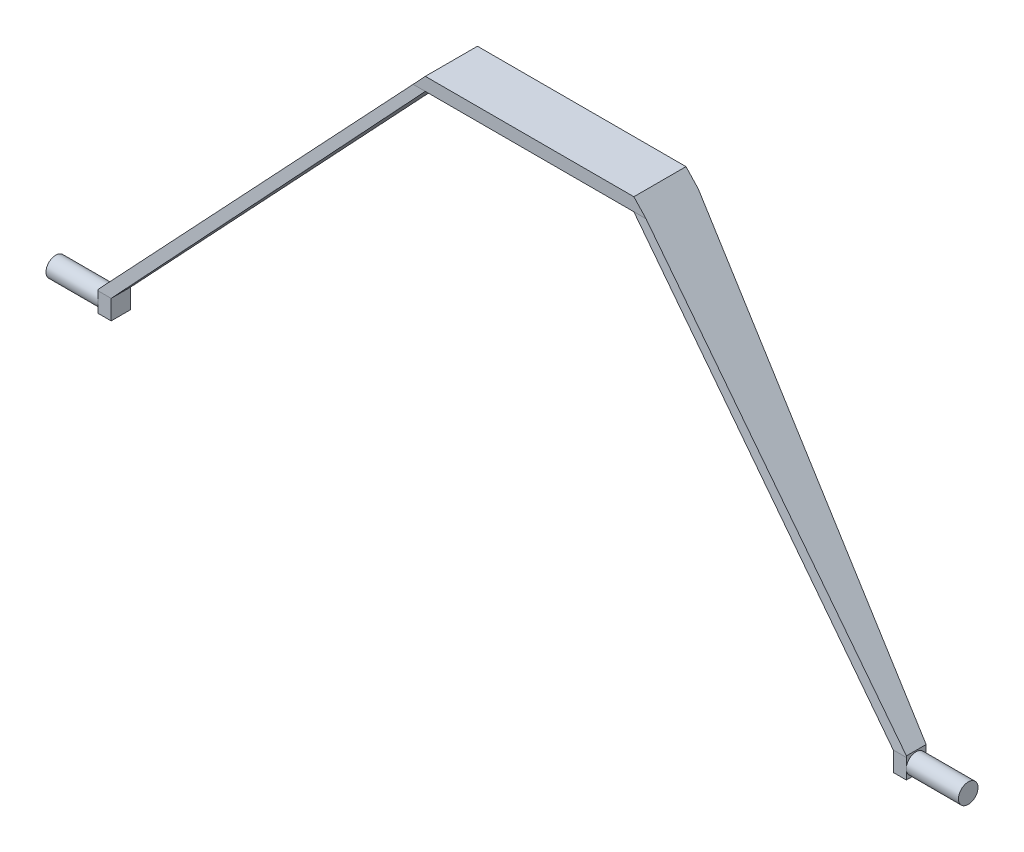
ISO-10303-21;
HEADER;
FILE_DESCRIPTION(('STEP AP214'),'2;1');
FILE_NAME('part.step','',(''),(''),'','','');
FILE_SCHEMA(('AUTOMOTIVE_DESIGN { 1 0 10303 214 1 1 1 1 }'));
ENDSEC;
DATA;
#1=APPLICATION_CONTEXT('core data for automotive mechanical design processes');
#2=APPLICATION_PROTOCOL_DEFINITION('international standard','automotive_design',2000,#1);
#3=PRODUCT_CONTEXT('',#1,'mechanical');
#4=PRODUCT('Part','Part','',(#3));
#5=PRODUCT_RELATED_PRODUCT_CATEGORY('part','',(#4));
#6=PRODUCT_DEFINITION_FORMATION('','',#4);
#7=PRODUCT_DEFINITION_CONTEXT('part definition',#1,'design');
#8=PRODUCT_DEFINITION('design','',#6,#7);
#9=PRODUCT_DEFINITION_SHAPE('','',#8);
#10=(LENGTH_UNIT() NAMED_UNIT(*) SI_UNIT(.MILLI.,.METRE.));
#11=(NAMED_UNIT(*) PLANE_ANGLE_UNIT() SI_UNIT($,.RADIAN.));
#12=(NAMED_UNIT(*) SI_UNIT($,.STERADIAN.) SOLID_ANGLE_UNIT());
#13=UNCERTAINTY_MEASURE_WITH_UNIT(LENGTH_MEASURE(1.E-05),#10,'distance_accuracy_value','');
#14=(GEOMETRIC_REPRESENTATION_CONTEXT(3) GLOBAL_UNCERTAINTY_ASSIGNED_CONTEXT((#13)) GLOBAL_UNIT_ASSIGNED_CONTEXT((#10,
#11,#12)) REPRESENTATION_CONTEXT('',''));
#15=CARTESIAN_POINT('',(0.,0.,0.));
#16=DIRECTION('',(0.,0.,1.));
#17=DIRECTION('',(1.,0.,0.));
#18=AXIS2_PLACEMENT_3D('',#15,#16,#17);
#19=CARTESIAN_POINT('',(787.471663752112,-383.669201703355,-101.6));
#20=DIRECTION('',(1.,0.,0.));
#21=DIRECTION('',(0.,0.,-1.));
#22=AXIS2_PLACEMENT_3D('',#19,#20,#21);
#23=PLANE('',#22);
#24=DIRECTION('',(0.,-0.981687652475557,0.190497645594452));
#25=VECTOR('',#24,1.);
#26=CARTESIAN_POINT('',(787.471663752112,-361.911223308586,10.5249486644394));
#27=LINE('',#26,#25);
#28=CARTESIAN_POINT('',(787.471663752112,-383.669201703355,14.7471100073535));
#29=VERTEX_POINT('',#28);
#30=CARTESIAN_POINT('',(787.471663752112,-386.209201703355,15.24));
#31=VERTEX_POINT('',#30);
#32=EDGE_CURVE('E274',#29,#31,#27,.T.);
#33=ORIENTED_EDGE('',*,*,#32,.F.);
#34=DIRECTION('',(0.,0.,1.));
#35=VECTOR('',#34,1.);
#36=CARTESIAN_POINT('',(787.471663752112,-383.669201703355,-101.6));
#37=LINE('',#36,#35);
#38=CARTESIAN_POINT('',(787.471663752112,-383.669201703355,53.114985003357));
#39=VERTEX_POINT('',#38);
#40=EDGE_CURVE('E189',#29,#39,#37,.T.);
#41=ORIENTED_EDGE('',*,*,#40,.T.);
#42=DIRECTION('',(0.,0.996098977899839,-0.0882429953418222));
#43=VECTOR('',#42,1.);
#44=CARTESIAN_POINT('',(787.471663752112,-370.069946760064,51.9102463004389));
#45=LINE('',#44,#43);
#46=CARTESIAN_POINT('',(787.471663752112,-386.209201703355,53.34));
#47=VERTEX_POINT('',#46);
#48=EDGE_CURVE('E295',#47,#39,#45,.T.);
#49=ORIENTED_EDGE('',*,*,#48,.F.);
#50=DIRECTION('',(0.,1.,0.));
#51=VECTOR('',#50,1.);
#52=CARTESIAN_POINT('',(787.471663752112,-383.669201703355,53.34));
#53=LINE('',#52,#51);
#54=CARTESIAN_POINT('',(787.471663752112,-405.259201703355,53.34));
#55=VERTEX_POINT('',#54);
#56=EDGE_CURVE('E393',#55,#47,#53,.T.);
#57=ORIENTED_EDGE('',*,*,#56,.F.);
#58=CARTESIAN_POINT('',(787.471663752112,-405.259201703355,34.29));
#59=DIRECTION('',(1.,0.,0.));
#60=DIRECTION('',(0.,0.,-1.));
#61=AXIS2_PLACEMENT_3D('',#58,#59,#60);
#62=CIRCLE('',#61,19.05);
#63=CARTESIAN_POINT('',(787.471663752112,-405.259201703355,15.24));
#64=VERTEX_POINT('',#63);
#65=EDGE_CURVE('E214',#64,#55,#62,.T.);
#66=ORIENTED_EDGE('',*,*,#65,.F.);
#67=DIRECTION('',(0.,-1.,0.));
#68=VECTOR('',#67,1.);
#69=CARTESIAN_POINT('',(787.471663752112,-383.669201703355,15.24));
#70=LINE('',#69,#68);
#71=EDGE_CURVE('E307',#31,#64,#70,.T.);
#72=ORIENTED_EDGE('',*,*,#71,.F.);
#73=EDGE_LOOP('',(#33,#41,#49,#57,#66,#72));
#74=FACE_BOUND('',#73,.T.);
#75=ADVANCED_FACE('F39',(#74),#23,.T.);
#76=CARTESIAN_POINT('',(-787.471663752112,-383.669201703355,-101.6));
#77=DIRECTION('',(-1.,0.,0.));
#78=DIRECTION('',(0.,0.,1.));
#79=AXIS2_PLACEMENT_3D('',#76,#77,#78);
#80=PLANE('',#79);
#81=DIRECTION('',(0.,0.981687652475557,-0.190497645594452));
#82=VECTOR('',#81,1.);
#83=CARTESIAN_POINT('',(-787.471663752112,-361.911223308586,10.5249486644394));
#84=LINE('',#83,#82);
#85=CARTESIAN_POINT('',(-787.471663752112,-386.209201703355,15.24));
#86=VERTEX_POINT('',#85);
#87=CARTESIAN_POINT('',(-787.471663752112,-383.669201703355,14.7471100073535));
#88=VERTEX_POINT('',#87);
#89=EDGE_CURVE('E292',#86,#88,#84,.T.);
#90=ORIENTED_EDGE('',*,*,#89,.F.);
#91=DIRECTION('',(0.,1.,0.));
#92=VECTOR('',#91,1.);
#93=CARTESIAN_POINT('',(-787.471663752112,-383.669201703355,15.24));
#94=LINE('',#93,#92);
#95=CARTESIAN_POINT('',(-787.471663752112,-405.259201703355,15.24));
#96=VERTEX_POINT('',#95);
#97=EDGE_CURVE('E318',#96,#86,#94,.T.);
#98=ORIENTED_EDGE('',*,*,#97,.F.);
#99=CARTESIAN_POINT('',(-787.471663752112,-405.259201703355,34.29));
#100=DIRECTION('',(1.,0.,0.));
#101=DIRECTION('',(0.,0.,-1.));
#102=AXIS2_PLACEMENT_3D('',#99,#100,#101);
#103=CIRCLE('',#102,19.05);
#104=CARTESIAN_POINT('',(-787.471663752112,-405.259201703355,53.34));
#105=VERTEX_POINT('',#104);
#106=EDGE_CURVE('E261',#96,#105,#103,.T.);
#107=ORIENTED_EDGE('',*,*,#106,.T.);
#108=DIRECTION('',(0.,-1.,0.));
#109=VECTOR('',#108,1.);
#110=CARTESIAN_POINT('',(-787.471663752112,-383.669201703355,53.34));
#111=LINE('',#110,#109);
#112=CARTESIAN_POINT('',(-787.471663752112,-386.209201703355,53.34));
#113=VERTEX_POINT('',#112);
#114=EDGE_CURVE('E63',#113,#105,#111,.T.);
#115=ORIENTED_EDGE('',*,*,#114,.F.);
#116=DIRECTION('',(0.,-0.996098977899839,0.0882429953418222));
#117=VECTOR('',#116,1.);
#118=CARTESIAN_POINT('',(-787.471663752112,-370.069946760064,51.9102463004389));
#119=LINE('',#118,#117);
#120=CARTESIAN_POINT('',(-787.471663752112,-383.669201703355,53.114985003357));
#121=VERTEX_POINT('',#120);
#122=EDGE_CURVE('E304',#121,#113,#119,.T.);
#123=ORIENTED_EDGE('',*,*,#122,.F.);
#124=DIRECTION('',(0.,0.,1.));
#125=VECTOR('',#124,1.);
#126=CARTESIAN_POINT('',(-787.471663752112,-383.669201703355,-101.6));
#127=LINE('',#126,#125);
#128=EDGE_CURVE('E203',#88,#121,#127,.T.);
#129=ORIENTED_EDGE('',*,*,#128,.F.);
#130=EDGE_LOOP('',(#90,#98,#107,#115,#123,#129));
#131=FACE_BOUND('',#130,.T.);
#132=ADVANCED_FACE('F364',(#131),#80,.T.);
#133=CARTESIAN_POINT('',(0.,0.,53.34));
#134=DIRECTION('',(0.,0.,1.));
#135=DIRECTION('',(1.,0.,0.));
#136=AXIS2_PLACEMENT_3D('',#133,#134,#135);
#137=PLANE('',#136);
#138=DIRECTION('',(1.,0.,0.));
#139=VECTOR('',#138,1.);
#140=CARTESIAN_POINT('',(0.,-386.209201703355,53.34));
#141=LINE('',#140,#139);
#142=CARTESIAN_POINT('',(-762.071663752111,-386.209201703355,53.34));
#143=VERTEX_POINT('',#142);
#144=EDGE_CURVE('E48',#113,#143,#141,.T.);
#145=ORIENTED_EDGE('',*,*,#144,.F.);
#146=ORIENTED_EDGE('',*,*,#114,.T.);
#147=CARTESIAN_POINT('',(-787.471663752112,-424.309201703355,53.34));
#148=VERTEX_POINT('',#147);
#149=EDGE_CURVE('E420',#105,#148,#111,.T.);
#150=ORIENTED_EDGE('',*,*,#149,.T.);
#151=DIRECTION('',(1.,0.,0.));
#152=VECTOR('',#151,1.);
#153=CARTESIAN_POINT('',(-787.471663752112,-424.309201703355,53.34));
#154=LINE('',#153,#152);
#155=CARTESIAN_POINT('',(-762.071663752112,-424.309201703355,53.34));
#156=VERTEX_POINT('',#155);
#157=EDGE_CURVE('E376',#148,#156,#154,.T.);
#158=ORIENTED_EDGE('',*,*,#157,.T.);
#159=DIRECTION('',(0.,1.,0.));
#160=VECTOR('',#159,1.);
#161=CARTESIAN_POINT('',(-762.071663752112,-424.309201703355,53.34));
#162=LINE('',#161,#160);
#163=EDGE_CURVE('E374',#156,#143,#162,.T.);
#164=ORIENTED_EDGE('',*,*,#163,.T.);
#165=EDGE_LOOP('',(#145,#146,#150,#158,#164));
#166=FACE_BOUND('',#165,.T.);
#167=ADVANCED_FACE('F371',(#166),#137,.T.);
#168=ORIENTED_EDGE('',*,*,#149,.F.);
#169=CARTESIAN_POINT('',(-787.471663752112,-424.309201703355,34.29));
#170=VERTEX_POINT('',#169);
#171=EDGE_CURVE('E263',#105,#170,#103,.T.);
#172=ORIENTED_EDGE('',*,*,#171,.T.);
#173=DIRECTION('',(0.,0.,1.));
#174=VECTOR('',#173,1.);
#175=CARTESIAN_POINT('',(-787.471663752112,-424.309201703355,-101.6));
#176=LINE('',#175,#174);
#177=EDGE_CURVE('E249',#170,#148,#176,.T.);
#178=ORIENTED_EDGE('',*,*,#177,.T.);
#179=EDGE_LOOP('',(#168,#172,#178));
#180=FACE_BOUND('',#179,.T.);
#181=ADVANCED_FACE('F472',(#180),#80,.T.);
#182=CARTESIAN_POINT('',(787.471663752112,-424.309201703355,34.29));
#183=VERTEX_POINT('',#182);
#184=EDGE_CURVE('E283',#55,#183,#62,.T.);
#185=ORIENTED_EDGE('',*,*,#184,.F.);
#186=CARTESIAN_POINT('',(787.471663752112,-424.309201703355,53.34));
#187=VERTEX_POINT('',#186);
#188=EDGE_CURVE('E394',#187,#55,#53,.T.);
#189=ORIENTED_EDGE('',*,*,#188,.F.);
#190=DIRECTION('',(0.,0.,1.));
#191=VECTOR('',#190,1.);
#192=CARTESIAN_POINT('',(787.471663752112,-424.309201703355,-101.6));
#193=LINE('',#192,#191);
#194=EDGE_CURVE('E223',#183,#187,#193,.T.);
#195=ORIENTED_EDGE('',*,*,#194,.F.);
#196=EDGE_LOOP('',(#185,#189,#195));
#197=FACE_BOUND('',#196,.T.);
#198=ADVANCED_FACE('F413',(#197),#23,.T.);
#199=CARTESIAN_POINT('',(-203.2,241.3,-101.6));
#200=DIRECTION('',(-0.730491181160132,0.682922128977583,0.));
#201=DIRECTION('',(-0.682922128977583,-0.730491181160132,0.));
#202=AXIS2_PLACEMENT_3D('',#199,#200,#201);
#203=PLANE('',#202);
#204=DIRECTION('',(-0.676162571687912,-0.723260785805915,0.140349607636784));
#205=VECTOR('',#204,1.);
#206=CARTESIAN_POINT('',(-716.188478747163,-307.420774830618,-0.048987063755182));
#207=LINE('',#206,#205);
#208=CARTESIAN_POINT('',(-226.945970551598,215.9,-101.6));
#209=VERTEX_POINT('',#208);
#210=EDGE_CURVE('E55',#209,#88,#207,.T.);
#211=ORIENTED_EDGE('',*,*,#210,.T.);
#212=ORIENTED_EDGE('',*,*,#128,.T.);
#213=DIRECTION('',(0.681496635621806,0.728966394832361,-0.0645780987740409));
#214=VECTOR('',#213,1.);
#215=CARTESIAN_POINT('',(-723.937929376007,-315.71001470586,47.094577037175));
#216=LINE('',#215,#214);
#217=CARTESIAN_POINT('',(-226.945970551598,215.9,0.));
#218=VERTEX_POINT('',#217);
#219=EDGE_CURVE('E332',#121,#218,#216,.T.);
#220=ORIENTED_EDGE('',*,*,#219,.T.);
#221=DIRECTION('',(0.682922128977583,0.730491181160132,0.));
#222=VECTOR('',#221,1.);
#223=CARTESIAN_POINT('',(-713.347967728877,-304.382407554465,0.));
#224=LINE('',#223,#222);
#225=CARTESIAN_POINT('',(-203.2,241.3,0.));
#226=VERTEX_POINT('',#225);
#227=EDGE_CURVE('E326',#218,#226,#224,.T.);
#228=ORIENTED_EDGE('',*,*,#227,.T.);
#229=DIRECTION('',(0.,0.,1.));
#230=VECTOR('',#229,1.);
#231=CARTESIAN_POINT('',(-203.2,241.3,-101.6));
#232=LINE('',#231,#230);
#233=CARTESIAN_POINT('',(-203.2,241.3,-101.6));
#234=VERTEX_POINT('',#233);
#235=EDGE_CURVE('E210',#234,#226,#232,.T.);
#236=ORIENTED_EDGE('',*,*,#235,.F.);
#237=DIRECTION('',(-0.682922128977583,-0.730491181160132,0.));
#238=VECTOR('',#237,1.);
#239=CARTESIAN_POINT('',(-203.2,241.3,-101.6));
#240=LINE('',#239,#238);
#241=EDGE_CURVE('E206',#234,#209,#240,.T.);
#242=ORIENTED_EDGE('',*,*,#241,.T.);
#243=EDGE_LOOP('',(#211,#212,#220,#228,#236,#242));
#244=FACE_BOUND('',#243,.T.);
#245=ADVANCED_FACE('F41',(#244),#203,.T.);
#246=CARTESIAN_POINT('',(-203.2,241.3,-101.6));
#247=DIRECTION('',(0.,1.,0.));
#248=DIRECTION('',(-1.,0.,0.));
#249=AXIS2_PLACEMENT_3D('',#246,#247,#248);
#250=PLANE('',#249);
#251=DIRECTION('',(1.,0.,0.));
#252=VECTOR('',#251,1.);
#253=CARTESIAN_POINT('',(-1297.03997230565,241.3,0.));
#254=LINE('',#253,#252);
#255=CARTESIAN_POINT('',(203.2,241.3,0.));
#256=VERTEX_POINT('',#255);
#257=EDGE_CURVE('E321',#226,#256,#254,.T.);
#258=ORIENTED_EDGE('',*,*,#257,.T.);
#259=DIRECTION('',(0.,0.,1.));
#260=VECTOR('',#259,1.);
#261=CARTESIAN_POINT('',(203.2,241.3,-101.6));
#262=LINE('',#261,#260);
#263=CARTESIAN_POINT('',(203.2,241.3,-101.6));
#264=VERTEX_POINT('',#263);
#265=EDGE_CURVE('E215',#264,#256,#262,.T.);
#266=ORIENTED_EDGE('',*,*,#265,.F.);
#267=DIRECTION('',(-1.,0.,0.));
#268=VECTOR('',#267,1.);
#269=CARTESIAN_POINT('',(-203.2,241.3,-101.6));
#270=LINE('',#269,#268);
#271=EDGE_CURVE('E197',#264,#234,#270,.T.);
#272=ORIENTED_EDGE('',*,*,#271,.T.);
#273=ORIENTED_EDGE('',*,*,#235,.T.);
#274=EDGE_LOOP('',(#258,#266,#272,#273));
#275=FACE_BOUND('',#274,.T.);
#276=ADVANCED_FACE('F498',(#275),#250,.T.);
#277=CARTESIAN_POINT('',(203.2,241.3,-101.6));
#278=DIRECTION('',(0.730491181160132,0.682922128977584,0.));
#279=DIRECTION('',(-0.682922128977584,0.730491181160132,0.));
#280=AXIS2_PLACEMENT_3D('',#277,#278,#279);
#281=PLANE('',#280);
#282=DIRECTION('',(0.676162571687912,-0.723260785805915,0.140349607636784));
#283=VECTOR('',#282,1.);
#284=CARTESIAN_POINT('',(716.188478747164,-307.420774830618,-0.0489870637551265));
#285=LINE('',#284,#283);
#286=CARTESIAN_POINT('',(226.945970551598,215.9,-101.6));
#287=VERTEX_POINT('',#286);
#288=EDGE_CURVE('E172',#287,#29,#285,.T.);
#289=ORIENTED_EDGE('',*,*,#288,.F.);
#290=DIRECTION('',(-0.682922128977583,0.730491181160132,0.));
#291=VECTOR('',#290,1.);
#292=CARTESIAN_POINT('',(203.2,241.3,-101.6));
#293=LINE('',#292,#291);
#294=EDGE_CURVE('E185',#287,#264,#293,.T.);
#295=ORIENTED_EDGE('',*,*,#294,.T.);
#296=ORIENTED_EDGE('',*,*,#265,.T.);
#297=DIRECTION('',(-0.682922128977584,0.730491181160132,0.));
#298=VECTOR('',#297,1.);
#299=CARTESIAN_POINT('',(713.347967728877,-304.382407554465,0.));
#300=LINE('',#299,#298);
#301=CARTESIAN_POINT('',(226.945970551598,215.9,0.));
#302=VERTEX_POINT('',#301);
#303=EDGE_CURVE('E340',#302,#256,#300,.T.);
#304=ORIENTED_EDGE('',*,*,#303,.F.);
#305=DIRECTION('',(-0.681496635621806,0.728966394832361,-0.0645780987740408));
#306=VECTOR('',#305,1.);
#307=CARTESIAN_POINT('',(723.937929376008,-315.71001470586,47.094577037175));
#308=LINE('',#307,#306);
#309=EDGE_CURVE('E336',#39,#302,#308,.T.);
#310=ORIENTED_EDGE('',*,*,#309,.F.);
#311=ORIENTED_EDGE('',*,*,#40,.F.);
#312=EDGE_LOOP('',(#289,#295,#296,#304,#310,#311));
#313=FACE_BOUND('',#312,.T.);
#314=ADVANCED_FACE('F183',(#313),#281,.T.);
#315=CARTESIAN_POINT('',(787.471663752112,-424.309201703355,15.24));
#316=VERTEX_POINT('',#315);
#317=EDGE_CURVE('E315',#64,#316,#70,.T.);
#318=ORIENTED_EDGE('',*,*,#317,.F.);
#319=EDGE_CURVE('E268',#183,#64,#62,.T.);
#320=ORIENTED_EDGE('',*,*,#319,.F.);
#321=EDGE_CURVE('E220',#316,#183,#193,.T.);
#322=ORIENTED_EDGE('',*,*,#321,.F.);
#323=EDGE_LOOP('',(#318,#320,#322));
#324=FACE_BOUND('',#323,.T.);
#325=ADVANCED_FACE('F429',(#324),#23,.T.);
#326=CARTESIAN_POINT('',(787.471663752112,-424.309201703355,-101.6));
#327=DIRECTION('',(0.,-1.,0.));
#328=DIRECTION('',(0.,0.,-1.));
#329=AXIS2_PLACEMENT_3D('',#326,#327,#328);
#330=PLANE('',#329);
#331=DIRECTION('',(1.,0.,0.));
#332=VECTOR('',#331,1.);
#333=CARTESIAN_POINT('',(-1297.03997230565,-424.309201703355,15.24));
#334=LINE('',#333,#332);
#335=CARTESIAN_POINT('',(762.071663752112,-424.309201703355,15.24));
#336=VERTEX_POINT('',#335);
#337=EDGE_CURVE('E347',#336,#316,#334,.T.);
#338=ORIENTED_EDGE('',*,*,#337,.T.);
#339=ORIENTED_EDGE('',*,*,#321,.T.);
#340=ORIENTED_EDGE('',*,*,#194,.T.);
#341=DIRECTION('',(1.,0.,0.));
#342=VECTOR('',#341,1.);
#343=CARTESIAN_POINT('',(787.471663752112,-424.309201703355,53.34));
#344=LINE('',#343,#342);
#345=CARTESIAN_POINT('',(762.071663752112,-424.309201703355,53.34));
#346=VERTEX_POINT('',#345);
#347=EDGE_CURVE('E385',#346,#187,#344,.T.);
#348=ORIENTED_EDGE('',*,*,#347,.F.);
#349=DIRECTION('',(0.,0.,1.));
#350=VECTOR('',#349,1.);
#351=CARTESIAN_POINT('',(762.071663752112,-424.309201703355,-101.6));
#352=LINE('',#351,#350);
#353=EDGE_CURVE('E224',#336,#346,#352,.T.);
#354=ORIENTED_EDGE('',*,*,#353,.F.);
#355=EDGE_LOOP('',(#338,#339,#340,#348,#354));
#356=FACE_BOUND('',#355,.T.);
#357=ADVANCED_FACE('F435',(#356),#330,.T.);
#358=CARTESIAN_POINT('',(762.071663752112,-424.309201703355,-101.6));
#359=DIRECTION('',(-1.,0.,0.));
#360=DIRECTION('',(0.,0.,1.));
#361=AXIS2_PLACEMENT_3D('',#358,#359,#360);
#362=PLANE('',#361);
#363=DIRECTION('',(0.,1.,0.));
#364=VECTOR('',#363,1.);
#365=CARTESIAN_POINT('',(762.071663752112,-424.309201703355,15.24));
#366=LINE('',#365,#364);
#367=CARTESIAN_POINT('',(762.071663752112,-386.209201703355,15.24));
#368=VERTEX_POINT('',#367);
#369=EDGE_CURVE('E308',#336,#368,#366,.T.);
#370=ORIENTED_EDGE('',*,*,#369,.F.);
#371=ORIENTED_EDGE('',*,*,#353,.T.);
#372=DIRECTION('',(0.,-1.,0.));
#373=VECTOR('',#372,1.);
#374=CARTESIAN_POINT('',(762.071663752112,-424.309201703355,53.34));
#375=LINE('',#374,#373);
#376=CARTESIAN_POINT('',(762.071663752112,-386.209201703355,53.34));
#377=VERTEX_POINT('',#376);
#378=EDGE_CURVE('E380',#377,#346,#375,.T.);
#379=ORIENTED_EDGE('',*,*,#378,.F.);
#380=DIRECTION('',(0.,0.,1.));
#381=VECTOR('',#380,1.);
#382=CARTESIAN_POINT('',(762.071663752112,-386.209201703355,-101.6));
#383=LINE('',#382,#381);
#384=EDGE_CURVE('E227',#368,#377,#383,.T.);
#385=ORIENTED_EDGE('',*,*,#384,.F.);
#386=EDGE_LOOP('',(#370,#371,#379,#385));
#387=FACE_BOUND('',#386,.T.);
#388=ADVANCED_FACE('F438',(#387),#362,.T.);
#389=CARTESIAN_POINT('',(762.071663752112,-386.209201703355,-101.6));
#390=DIRECTION('',(-0.732932920293633,-0.680300914559025,0.));
#391=DIRECTION('',(0.680300914559025,-0.732932920293633,0.));
#392=AXIS2_PLACEMENT_3D('',#389,#390,#391);
#393=PLANE('',#392);
#394=DIRECTION('',(-0.673522882906171,0.725630500986452,-0.140809453659583));
#395=VECTOR('',#394,1.);
#396=CARTESIAN_POINT('',(750.990746361577,-374.271000579751,12.9233780062889));
#397=LINE('',#396,#395);
#398=CARTESIAN_POINT('',(203.2,215.9,-101.6));
#399=VERTEX_POINT('',#398);
#400=EDGE_CURVE('E176',#368,#399,#397,.T.);
#401=ORIENTED_EDGE('',*,*,#400,.F.);
#402=ORIENTED_EDGE('',*,*,#384,.T.);
#403=DIRECTION('',(0.678871413535743,-0.731392824819506,0.0647930527643605));
#404=VECTOR('',#403,1.);
#405=CARTESIAN_POINT('',(755.256449466988,-378.866723100837,52.6895402369698));
#406=LINE('',#405,#404);
#407=CARTESIAN_POINT('',(203.2,215.9,0.));
#408=VERTEX_POINT('',#407);
#409=EDGE_CURVE('E298',#408,#377,#406,.T.);
#410=ORIENTED_EDGE('',*,*,#409,.F.);
#411=DIRECTION('',(0.,0.,1.));
#412=VECTOR('',#411,1.);
#413=CARTESIAN_POINT('',(203.2,215.9,-101.6));
#414=LINE('',#413,#412);
#415=EDGE_CURVE('E231',#399,#408,#414,.T.);
#416=ORIENTED_EDGE('',*,*,#415,.F.);
#417=EDGE_LOOP('',(#401,#402,#410,#416));
#418=FACE_BOUND('',#417,.T.);
#419=ADVANCED_FACE('F441',(#418),#393,.T.);
#420=CARTESIAN_POINT('',(-203.2,215.9,-101.6));
#421=DIRECTION('',(0.,-1.,0.));
#422=DIRECTION('',(1.,0.,0.));
#423=AXIS2_PLACEMENT_3D('',#420,#421,#422);
#424=PLANE('',#423);
#425=DIRECTION('',(1.,0.,0.));
#426=VECTOR('',#425,1.);
#427=CARTESIAN_POINT('',(-1297.03997230565,215.9,0.));
#428=LINE('',#427,#426);
#429=CARTESIAN_POINT('',(-203.2,215.9,0.));
#430=VERTEX_POINT('',#429);
#431=EDGE_CURVE('E327',#430,#408,#428,.T.);
#432=ORIENTED_EDGE('',*,*,#431,.F.);
#433=DIRECTION('',(0.,0.,1.));
#434=VECTOR('',#433,1.);
#435=CARTESIAN_POINT('',(-203.2,215.9,-101.6));
#436=LINE('',#435,#434);
#437=CARTESIAN_POINT('',(-203.2,215.9,-101.6));
#438=VERTEX_POINT('',#437);
#439=EDGE_CURVE('E235',#438,#430,#436,.T.);
#440=ORIENTED_EDGE('',*,*,#439,.F.);
#441=DIRECTION('',(1.,0.,0.));
#442=VECTOR('',#441,1.);
#443=CARTESIAN_POINT('',(-203.2,215.9,-101.6));
#444=LINE('',#443,#442);
#445=EDGE_CURVE('E199',#438,#399,#444,.T.);
#446=ORIENTED_EDGE('',*,*,#445,.T.);
#447=ORIENTED_EDGE('',*,*,#415,.T.);
#448=EDGE_LOOP('',(#432,#440,#446,#447));
#449=FACE_BOUND('',#448,.T.);
#450=ADVANCED_FACE('F446',(#449),#424,.T.);
#451=CARTESIAN_POINT('',(-762.071663752112,-386.209201703355,-101.6));
#452=DIRECTION('',(0.732932920293634,-0.680300914559025,0.));
#453=DIRECTION('',(0.680300914559025,0.732932920293634,0.));
#454=AXIS2_PLACEMENT_3D('',#451,#452,#453);
#455=PLANE('',#454);
#456=DIRECTION('',(-0.673522882906171,-0.725630500986452,0.140809453659583));
#457=VECTOR('',#456,1.);
#458=CARTESIAN_POINT('',(-750.990746361577,-374.271000579751,12.9233780062889));
#459=LINE('',#458,#457);
#460=CARTESIAN_POINT('',(-762.071663752112,-386.209201703355,15.24));
#461=VERTEX_POINT('',#460);
#462=EDGE_CURVE('E287',#438,#461,#459,.T.);
#463=ORIENTED_EDGE('',*,*,#462,.F.);
#464=ORIENTED_EDGE('',*,*,#439,.T.);
#465=DIRECTION('',(0.678871413535743,0.731392824819506,-0.0647930527643606));
#466=VECTOR('',#465,1.);
#467=CARTESIAN_POINT('',(-755.256449466988,-378.866723100838,52.6895402369698));
#468=LINE('',#467,#466);
#469=EDGE_CURVE('E301',#143,#430,#468,.T.);
#470=ORIENTED_EDGE('',*,*,#469,.F.);
#471=DIRECTION('',(0.,0.,1.));
#472=VECTOR('',#471,1.);
#473=CARTESIAN_POINT('',(-762.071663752112,-386.209201703355,-101.6));
#474=LINE('',#473,#472);
#475=EDGE_CURVE('E239',#461,#143,#474,.T.);
#476=ORIENTED_EDGE('',*,*,#475,.F.);
#477=EDGE_LOOP('',(#463,#464,#470,#476));
#478=FACE_BOUND('',#477,.T.);
#479=ADVANCED_FACE('F453',(#478),#455,.T.);
#480=CARTESIAN_POINT('',(-762.071663752112,-424.309201703355,-101.6));
#481=DIRECTION('',(1.,0.,0.));
#482=DIRECTION('',(0.,0.,-1.));
#483=AXIS2_PLACEMENT_3D('',#480,#481,#482);
#484=PLANE('',#483);
#485=DIRECTION('',(0.,-1.,0.));
#486=VECTOR('',#485,1.);
#487=CARTESIAN_POINT('',(-762.071663752112,-424.309201703355,15.24));
#488=LINE('',#487,#486);
#489=CARTESIAN_POINT('',(-762.071663752112,-424.309201703355,15.24));
#490=VERTEX_POINT('',#489);
#491=EDGE_CURVE('E311',#461,#490,#488,.T.);
#492=ORIENTED_EDGE('',*,*,#491,.F.);
#493=ORIENTED_EDGE('',*,*,#475,.T.);
#494=ORIENTED_EDGE('',*,*,#163,.F.);
#495=DIRECTION('',(0.,0.,1.));
#496=VECTOR('',#495,1.);
#497=CARTESIAN_POINT('',(-762.071663752112,-424.309201703355,-101.6));
#498=LINE('',#497,#496);
#499=EDGE_CURVE('E243',#490,#156,#498,.T.);
#500=ORIENTED_EDGE('',*,*,#499,.F.);
#501=EDGE_LOOP('',(#492,#493,#494,#500));
#502=FACE_BOUND('',#501,.T.);
#503=ADVANCED_FACE('F455',(#502),#484,.T.);
#504=CARTESIAN_POINT('',(-787.471663752112,-424.309201703355,-101.6));
#505=DIRECTION('',(0.,-1.,0.));
#506=DIRECTION('',(0.,0.,-1.));
#507=AXIS2_PLACEMENT_3D('',#504,#505,#506);
#508=PLANE('',#507);
#509=CARTESIAN_POINT('',(-787.471663752112,-424.309201703355,15.24));
#510=VERTEX_POINT('',#509);
#511=EDGE_CURVE('E343',#510,#490,#334,.T.);
#512=ORIENTED_EDGE('',*,*,#511,.T.);
#513=ORIENTED_EDGE('',*,*,#499,.T.);
#514=ORIENTED_EDGE('',*,*,#157,.F.);
#515=ORIENTED_EDGE('',*,*,#177,.F.);
#516=EDGE_CURVE('E246',#510,#170,#176,.T.);
#517=ORIENTED_EDGE('',*,*,#516,.F.);
#518=EDGE_LOOP('',(#512,#513,#514,#515,#517));
#519=FACE_BOUND('',#518,.T.);
#520=ADVANCED_FACE('F461',(#519),#508,.T.);
#521=EDGE_CURVE('E314',#510,#96,#94,.T.);
#522=ORIENTED_EDGE('',*,*,#521,.F.);
#523=ORIENTED_EDGE('',*,*,#516,.T.);
#524=EDGE_CURVE('E254',#170,#96,#103,.T.);
#525=ORIENTED_EDGE('',*,*,#524,.T.);
#526=EDGE_LOOP('',(#522,#523,#525));
#527=FACE_BOUND('',#526,.T.);
#528=ADVANCED_FACE('F478',(#527),#80,.T.);
#529=CARTESIAN_POINT('',(0.,0.,-101.6));
#530=DIRECTION('',(0.,0.,1.));
#531=DIRECTION('',(1.,0.,0.));
#532=AXIS2_PLACEMENT_3D('',#529,#530,#531);
#533=PLANE('',#532);
#534=ORIENTED_EDGE('',*,*,#294,.F.);
#535=DIRECTION('',(-1.,0.,0.));
#536=VECTOR('',#535,1.);
#537=CARTESIAN_POINT('',(0.,215.9,-101.6));
#538=LINE('',#537,#536);
#539=EDGE_CURVE('E11',#287,#399,#538,.T.);
#540=ORIENTED_EDGE('',*,*,#539,.T.);
#541=ORIENTED_EDGE('',*,*,#445,.F.);
#542=DIRECTION('',(1.,0.,0.));
#543=VECTOR('',#542,1.);
#544=CARTESIAN_POINT('',(-1297.03997230565,215.9,-101.6));
#545=LINE('',#544,#543);
#546=EDGE_CURVE('E191',#209,#438,#545,.T.);
#547=ORIENTED_EDGE('',*,*,#546,.F.);
#548=ORIENTED_EDGE('',*,*,#241,.F.);
#549=ORIENTED_EDGE('',*,*,#271,.F.);
#550=EDGE_LOOP('',(#534,#540,#541,#547,#548,#549));
#551=FACE_BOUND('',#550,.T.);
#552=ADVANCED_FACE('F194',(#551),#533,.F.);
#553=EDGE_CURVE('E252',#377,#47,#141,.T.);
#554=ORIENTED_EDGE('',*,*,#553,.F.);
#555=ORIENTED_EDGE('',*,*,#378,.T.);
#556=ORIENTED_EDGE('',*,*,#347,.T.);
#557=ORIENTED_EDGE('',*,*,#188,.T.);
#558=ORIENTED_EDGE('',*,*,#56,.T.);
#559=EDGE_LOOP('',(#554,#555,#556,#557,#558));
#560=FACE_BOUND('',#559,.T.);
#561=ADVANCED_FACE('F402',(#560),#137,.T.);
#562=CARTESIAN_POINT('',(889.071663752112,-405.259201703355,34.29));
#563=DIRECTION('',(-1.,0.,0.));
#564=DIRECTION('',(0.,0.,1.));
#565=AXIS2_PLACEMENT_3D('',#562,#563,#564);
#566=CYLINDRICAL_SURFACE('',#565,19.05);
#567=ORIENTED_EDGE('',*,*,#319,.T.);
#568=ORIENTED_EDGE('',*,*,#65,.T.);
#569=ORIENTED_EDGE('',*,*,#184,.T.);
#570=EDGE_LOOP('',(#567,#568,#569));
#571=FACE_BOUND('',#570,.T.);
#572=CARTESIAN_POINT('',(889.071663752112,-405.259201703355,34.29));
#573=DIRECTION('',(1.,0.,0.));
#574=DIRECTION('',(0.,0.,-1.));
#575=AXIS2_PLACEMENT_3D('',#572,#573,#574);
#576=CIRCLE('',#575,19.05);
#577=CARTESIAN_POINT('',(889.071663752112,-405.259201703355,15.24));
#578=VERTEX_POINT('',#577);
#579=EDGE_CURVE('E416',#578,#578,#576,.T.);
#580=ORIENTED_EDGE('',*,*,#579,.F.);
#581=EDGE_LOOP('',(#580));
#582=FACE_BOUND('',#581,.T.);
#583=ADVANCED_FACE('F424',(#571,#582),#566,.T.);
#584=CARTESIAN_POINT('',(889.071663752112,-405.259201703355,34.29));
#585=DIRECTION('',(1.,0.,0.));
#586=DIRECTION('',(0.,0.,-1.));
#587=AXIS2_PLACEMENT_3D('',#584,#585,#586);
#588=PLANE('',#587);
#589=ORIENTED_EDGE('',*,*,#579,.T.);
#590=EDGE_LOOP('',(#589));
#591=FACE_BOUND('',#590,.T.);
#592=ADVANCED_FACE('F510',(#591),#588,.T.);
#593=CARTESIAN_POINT('',(-889.071663752112,-405.259201703355,34.29));
#594=DIRECTION('',(1.,0.,0.));
#595=DIRECTION('',(0.,0.,-1.));
#596=AXIS2_PLACEMENT_3D('',#593,#594,#595);
#597=CYLINDRICAL_SURFACE('',#596,19.05);
#598=CARTESIAN_POINT('',(-889.071663752112,-405.259201703355,34.29));
#599=DIRECTION('',(1.,0.,0.));
#600=DIRECTION('',(0.,0.,-1.));
#601=AXIS2_PLACEMENT_3D('',#598,#599,#600);
#602=CIRCLE('',#601,19.05);
#603=CARTESIAN_POINT('',(-889.071663752112,-405.259201703355,15.24));
#604=VERTEX_POINT('',#603);
#605=EDGE_CURVE('E273',#604,#604,#602,.T.);
#606=ORIENTED_EDGE('',*,*,#605,.T.);
#607=EDGE_LOOP('',(#606));
#608=FACE_BOUND('',#607,.T.);
#609=ORIENTED_EDGE('',*,*,#171,.F.);
#610=ORIENTED_EDGE('',*,*,#106,.F.);
#611=ORIENTED_EDGE('',*,*,#524,.F.);
#612=EDGE_LOOP('',(#609,#610,#611));
#613=FACE_BOUND('',#612,.T.);
#614=ADVANCED_FACE('F471',(#608,#613),#597,.T.);
#615=CARTESIAN_POINT('',(-889.071663752112,-405.259201703355,34.29));
#616=DIRECTION('',(-1.,0.,0.));
#617=DIRECTION('',(0.,0.,-1.));
#618=AXIS2_PLACEMENT_3D('',#615,#616,#617);
#619=PLANE('',#618);
#620=ORIENTED_EDGE('',*,*,#605,.F.);
#621=EDGE_LOOP('',(#620));
#622=FACE_BOUND('',#621,.T.);
#623=ADVANCED_FACE('F516',(#622),#619,.T.);
#624=CARTESIAN_POINT('',(-1297.03997230565,215.9,0.));
#625=DIRECTION('',(0.,-0.0882429953418222,-0.996098977899839));
#626=DIRECTION('',(0.,0.996098977899839,-0.0882429953418222));
#627=AXIS2_PLACEMENT_3D('',#624,#625,#626);
#628=PLANE('',#627);
#629=ORIENTED_EDGE('',*,*,#48,.T.);
#630=ORIENTED_EDGE('',*,*,#309,.T.);
#631=EDGE_CURVE('E328',#408,#302,#428,.T.);
#632=ORIENTED_EDGE('',*,*,#631,.F.);
#633=ORIENTED_EDGE('',*,*,#409,.T.);
#634=ORIENTED_EDGE('',*,*,#553,.T.);
#635=EDGE_LOOP('',(#629,#630,#632,#633,#634));
#636=FACE_BOUND('',#635,.T.);
#637=ADVANCED_FACE('F520',(#636),#628,.F.);
#638=ORIENTED_EDGE('',*,*,#469,.T.);
#639=EDGE_CURVE('E322',#218,#430,#428,.T.);
#640=ORIENTED_EDGE('',*,*,#639,.F.);
#641=ORIENTED_EDGE('',*,*,#219,.F.);
#642=ORIENTED_EDGE('',*,*,#122,.T.);
#643=ORIENTED_EDGE('',*,*,#144,.T.);
#644=EDGE_LOOP('',(#638,#640,#641,#642,#643));
#645=FACE_BOUND('',#644,.T.);
#646=ADVANCED_FACE('F367',(#645),#628,.F.);
#647=CARTESIAN_POINT('',(-1297.03997230565,241.3,0.));
#648=DIRECTION('',(0.,0.,-1.));
#649=DIRECTION('',(-1.,0.,0.));
#650=AXIS2_PLACEMENT_3D('',#647,#648,#649);
#651=PLANE('',#650);
#652=ORIENTED_EDGE('',*,*,#639,.T.);
#653=ORIENTED_EDGE('',*,*,#431,.T.);
#654=ORIENTED_EDGE('',*,*,#631,.T.);
#655=ORIENTED_EDGE('',*,*,#303,.T.);
#656=ORIENTED_EDGE('',*,*,#257,.F.);
#657=ORIENTED_EDGE('',*,*,#227,.F.);
#658=EDGE_LOOP('',(#652,#653,#654,#655,#656,#657));
#659=FACE_BOUND('',#658,.T.);
#660=ADVANCED_FACE('F524',(#659),#651,.F.);
#661=CARTESIAN_POINT('',(-1297.03997230565,215.9,-101.6));
#662=DIRECTION('',(0.,0.190497645594452,0.981687652475557));
#663=DIRECTION('',(0.,-0.981687652475557,0.190497645594452));
#664=AXIS2_PLACEMENT_3D('',#661,#662,#663);
#665=PLANE('',#664);
#666=ORIENTED_EDGE('',*,*,#462,.T.);
#667=DIRECTION('',(1.,0.,0.));
#668=VECTOR('',#667,1.);
#669=CARTESIAN_POINT('',(-1297.03997230565,-386.209201703355,15.24));
#670=LINE('',#669,#668);
#671=EDGE_CURVE('E351',#86,#461,#670,.T.);
#672=ORIENTED_EDGE('',*,*,#671,.F.);
#673=ORIENTED_EDGE('',*,*,#89,.T.);
#674=ORIENTED_EDGE('',*,*,#210,.F.);
#675=ORIENTED_EDGE('',*,*,#546,.T.);
#676=EDGE_LOOP('',(#666,#672,#673,#674,#675));
#677=FACE_BOUND('',#676,.T.);
#678=ADVANCED_FACE('F448',(#677),#665,.F.);
#679=CARTESIAN_POINT('',(-1297.03997230565,-386.209201703355,15.24));
#680=DIRECTION('',(0.,0.,1.));
#681=DIRECTION('',(0.,-1.,0.));
#682=AXIS2_PLACEMENT_3D('',#679,#680,#681);
#683=PLANE('',#682);
#684=ORIENTED_EDGE('',*,*,#491,.T.);
#685=ORIENTED_EDGE('',*,*,#511,.F.);
#686=ORIENTED_EDGE('',*,*,#521,.T.);
#687=ORIENTED_EDGE('',*,*,#97,.T.);
#688=ORIENTED_EDGE('',*,*,#671,.T.);
#689=EDGE_LOOP('',(#684,#685,#686,#687,#688));
#690=FACE_BOUND('',#689,.T.);
#691=ADVANCED_FACE('F458',(#690),#683,.F.);
#692=ORIENTED_EDGE('',*,*,#32,.T.);
#693=EDGE_CURVE('E354',#368,#31,#670,.T.);
#694=ORIENTED_EDGE('',*,*,#693,.F.);
#695=ORIENTED_EDGE('',*,*,#400,.T.);
#696=ORIENTED_EDGE('',*,*,#539,.F.);
#697=ORIENTED_EDGE('',*,*,#288,.T.);
#698=EDGE_LOOP('',(#692,#694,#695,#696,#697));
#699=FACE_BOUND('',#698,.T.);
#700=ADVANCED_FACE('F171',(#699),#665,.F.);
#701=ORIENTED_EDGE('',*,*,#71,.T.);
#702=ORIENTED_EDGE('',*,*,#317,.T.);
#703=ORIENTED_EDGE('',*,*,#337,.F.);
#704=ORIENTED_EDGE('',*,*,#369,.T.);
#705=ORIENTED_EDGE('',*,*,#693,.T.);
#706=EDGE_LOOP('',(#701,#702,#703,#704,#705));
#707=FACE_BOUND('',#706,.T.);
#708=ADVANCED_FACE('F431',(#707),#683,.F.);
#709=CLOSED_SHELL('',(#75,#132,#167,#181,#198,#245,#276,#314,#325,#357,#388,#419,#450,#479,#503,
#520,#528,#552,#561,#583,#592,#614,#623,#637,#646,#660,#678,#691,#700,#708));
#710=MANIFOLD_SOLID_BREP('B2',#709);
#711=ADVANCED_BREP_SHAPE_REPRESENTATION('',(#18,#710),#14);
#712=SHAPE_DEFINITION_REPRESENTATION(#9,#711);
ENDSEC;
END-ISO-10303-21;
